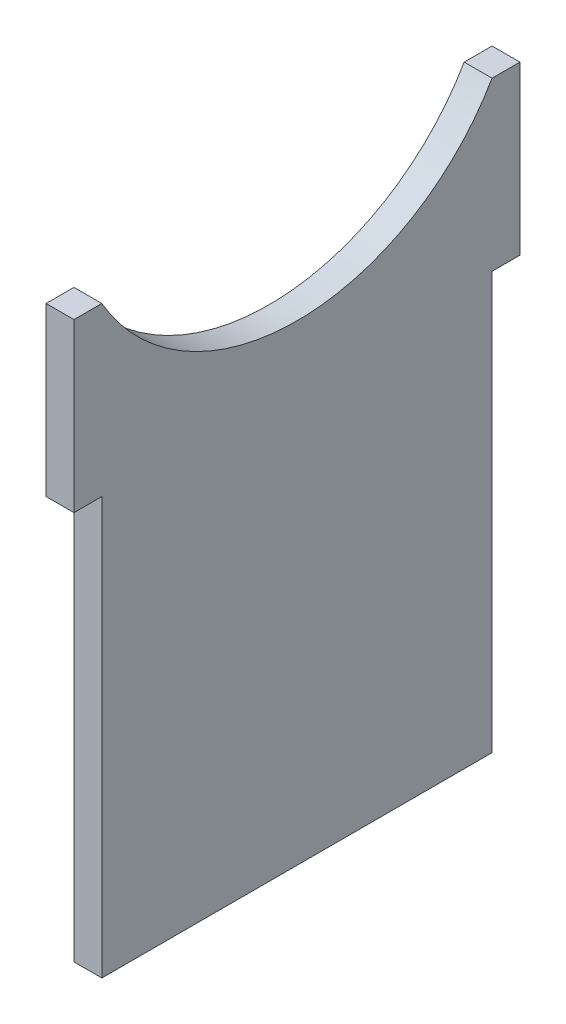
ISO-10303-21;
HEADER;
FILE_DESCRIPTION(('STEP AP214'),'2;1');
FILE_NAME('part.step','',(''),(''),'','','');
FILE_SCHEMA(('AUTOMOTIVE_DESIGN { 1 0 10303 214 1 1 1 1 }'));
ENDSEC;
DATA;
#1=APPLICATION_CONTEXT('core data for automotive mechanical design processes');
#2=APPLICATION_PROTOCOL_DEFINITION('international standard','automotive_design',2000,#1);
#3=PRODUCT_CONTEXT('',#1,'mechanical');
#4=PRODUCT('Part','Part','',(#3));
#5=PRODUCT_RELATED_PRODUCT_CATEGORY('part','',(#4));
#6=PRODUCT_DEFINITION_FORMATION('','',#4);
#7=PRODUCT_DEFINITION_CONTEXT('part definition',#1,'design');
#8=PRODUCT_DEFINITION('design','',#6,#7);
#9=PRODUCT_DEFINITION_SHAPE('','',#8);
#10=(LENGTH_UNIT() NAMED_UNIT(*) SI_UNIT(.MILLI.,.METRE.));
#11=(NAMED_UNIT(*) PLANE_ANGLE_UNIT() SI_UNIT($,.RADIAN.));
#12=(NAMED_UNIT(*) SI_UNIT($,.STERADIAN.) SOLID_ANGLE_UNIT());
#13=UNCERTAINTY_MEASURE_WITH_UNIT(LENGTH_MEASURE(1.E-05),#10,'distance_accuracy_value','');
#14=(GEOMETRIC_REPRESENTATION_CONTEXT(3) GLOBAL_UNCERTAINTY_ASSIGNED_CONTEXT((#13)) GLOBAL_UNIT_ASSIGNED_CONTEXT((#10,
#11,#12)) REPRESENTATION_CONTEXT('',''));
#15=CARTESIAN_POINT('',(0.,0.,0.));
#16=DIRECTION('',(0.,0.,1.));
#17=DIRECTION('',(1.,0.,0.));
#18=AXIS2_PLACEMENT_3D('',#15,#16,#17);
#19=CARTESIAN_POINT('',(1.5875,0.,0.));
#20=DIRECTION('',(-1.,0.,0.));
#21=DIRECTION('',(0.,0.,1.));
#22=AXIS2_PLACEMENT_3D('',#19,#20,#21);
#23=CYLINDRICAL_SURFACE('',#22,12.8316097327394);
#24=CARTESIAN_POINT('',(0.,0.,0.));
#25=DIRECTION('',(1.,0.,0.));
#26=DIRECTION('',(0.,0.,-1.));
#27=AXIS2_PLACEMENT_3D('',#24,#25,#26);
#28=CIRCLE('',#27,12.8316097327394);
#29=CARTESIAN_POINT('',(0.,-6.41580486636971,11.1125));
#30=VERTEX_POINT('',#29);
#31=CARTESIAN_POINT('',(0.,-6.41580486636971,-11.1125));
#32=VERTEX_POINT('',#31);
#33=EDGE_CURVE('E140',#30,#32,#28,.T.);
#34=ORIENTED_EDGE('',*,*,#33,.F.);
#35=DIRECTION('',(-1.,0.,0.));
#36=VECTOR('',#35,1.);
#37=CARTESIAN_POINT('',(1.5875,-6.41580486636971,11.1125));
#38=LINE('',#37,#36);
#39=CARTESIAN_POINT('',(1.5875,-6.41580486636971,11.1125));
#40=VERTEX_POINT('',#39);
#41=EDGE_CURVE('E11',#40,#30,#38,.T.);
#42=ORIENTED_EDGE('',*,*,#41,.F.);
#43=CARTESIAN_POINT('',(1.5875,0.,0.));
#44=DIRECTION('',(1.,0.,0.));
#45=DIRECTION('',(0.,0.,-1.));
#46=AXIS2_PLACEMENT_3D('',#43,#44,#45);
#47=CIRCLE('',#46,12.8316097327394);
#48=CARTESIAN_POINT('',(1.5875,-6.41580486636971,-11.1125));
#49=VERTEX_POINT('',#48);
#50=EDGE_CURVE('E162',#40,#49,#47,.T.);
#51=ORIENTED_EDGE('',*,*,#50,.T.);
#52=DIRECTION('',(-1.,0.,0.));
#53=VECTOR('',#52,1.);
#54=CARTESIAN_POINT('',(1.5875,-6.41580486636971,-11.1125));
#55=LINE('',#54,#53);
#56=EDGE_CURVE('E50',#49,#32,#55,.T.);
#57=ORIENTED_EDGE('',*,*,#56,.T.);
#58=EDGE_LOOP('',(#34,#42,#51,#57));
#59=FACE_BOUND('',#58,.T.);
#60=ADVANCED_FACE('F34',(#59),#23,.F.);
#61=CARTESIAN_POINT('',(1.5875,-6.41580486636971,0.));
#62=DIRECTION('',(0.,-1.,0.));
#63=DIRECTION('',(0.,0.,-1.));
#64=AXIS2_PLACEMENT_3D('',#61,#62,#63);
#65=PLANE('',#64);
#66=DIRECTION('',(0.,0.,1.));
#67=VECTOR('',#66,1.);
#68=CARTESIAN_POINT('',(0.,-6.41580486636971,0.));
#69=LINE('',#68,#67);
#70=CARTESIAN_POINT('',(0.,-6.41580486636971,12.7));
#71=VERTEX_POINT('',#70);
#72=EDGE_CURVE('E142',#30,#71,#69,.T.);
#73=ORIENTED_EDGE('',*,*,#72,.T.);
#74=DIRECTION('',(-1.,0.,0.));
#75=VECTOR('',#74,1.);
#76=CARTESIAN_POINT('',(1.5875,-6.41580486636971,12.7));
#77=LINE('',#76,#75);
#78=CARTESIAN_POINT('',(1.5875,-6.41580486636971,12.7));
#79=VERTEX_POINT('',#78);
#80=EDGE_CURVE('E42',#79,#71,#77,.T.);
#81=ORIENTED_EDGE('',*,*,#80,.F.);
#82=DIRECTION('',(0.,0.,1.));
#83=VECTOR('',#82,1.);
#84=CARTESIAN_POINT('',(1.5875,-6.41580486636971,0.));
#85=LINE('',#84,#83);
#86=EDGE_CURVE('E200',#40,#79,#85,.T.);
#87=ORIENTED_EDGE('',*,*,#86,.F.);
#88=ORIENTED_EDGE('',*,*,#41,.T.);
#89=EDGE_LOOP('',(#73,#81,#87,#88));
#90=FACE_BOUND('',#89,.T.);
#91=ADVANCED_FACE('F223',(#90),#65,.F.);
#92=CARTESIAN_POINT('',(1.5875,0.,12.7));
#93=DIRECTION('',(0.,0.,-1.));
#94=DIRECTION('',(0.,1.,0.));
#95=AXIS2_PLACEMENT_3D('',#92,#93,#94);
#96=PLANE('',#95);
#97=DIRECTION('',(0.,-1.,0.));
#98=VECTOR('',#97,1.);
#99=CARTESIAN_POINT('',(0.,0.,12.7));
#100=LINE('',#99,#98);
#101=CARTESIAN_POINT('',(0.,-15.9408048663697,12.7));
#102=VERTEX_POINT('',#101);
#103=EDGE_CURVE('E144',#71,#102,#100,.T.);
#104=ORIENTED_EDGE('',*,*,#103,.T.);
#105=DIRECTION('',(-1.,0.,0.));
#106=VECTOR('',#105,1.);
#107=CARTESIAN_POINT('',(1.5875,-15.9408048663697,12.7));
#108=LINE('',#107,#106);
#109=CARTESIAN_POINT('',(1.5875,-15.9408048663697,12.7));
#110=VERTEX_POINT('',#109);
#111=EDGE_CURVE('E174',#110,#102,#108,.T.);
#112=ORIENTED_EDGE('',*,*,#111,.F.);
#113=DIRECTION('',(0.,-1.,0.));
#114=VECTOR('',#113,1.);
#115=CARTESIAN_POINT('',(1.5875,0.,12.7));
#116=LINE('',#115,#114);
#117=EDGE_CURVE('E182',#79,#110,#116,.T.);
#118=ORIENTED_EDGE('',*,*,#117,.F.);
#119=ORIENTED_EDGE('',*,*,#80,.T.);
#120=EDGE_LOOP('',(#104,#112,#118,#119));
#121=FACE_BOUND('',#120,.T.);
#122=ADVANCED_FACE('F180',(#121),#96,.F.);
#123=CARTESIAN_POINT('',(1.5875,-15.9408048663697,0.));
#124=DIRECTION('',(0.,-1.,0.));
#125=DIRECTION('',(0.,0.,-1.));
#126=AXIS2_PLACEMENT_3D('',#123,#124,#125);
#127=PLANE('',#126);
#128=DIRECTION('',(0.,0.,1.));
#129=VECTOR('',#128,1.);
#130=CARTESIAN_POINT('',(0.,-15.9408048663697,0.));
#131=LINE('',#130,#129);
#132=CARTESIAN_POINT('',(0.,-15.9408048663697,11.1125));
#133=VERTEX_POINT('',#132);
#134=EDGE_CURVE('E147',#133,#102,#131,.T.);
#135=ORIENTED_EDGE('',*,*,#134,.F.);
#136=DIRECTION('',(-1.,0.,0.));
#137=VECTOR('',#136,1.);
#138=CARTESIAN_POINT('',(1.5875,-15.9408048663697,11.1125));
#139=LINE('',#138,#137);
#140=CARTESIAN_POINT('',(1.5875,-15.9408048663697,11.1125));
#141=VERTEX_POINT('',#140);
#142=EDGE_CURVE('E172',#141,#133,#139,.T.);
#143=ORIENTED_EDGE('',*,*,#142,.F.);
#144=DIRECTION('',(0.,0.,1.));
#145=VECTOR('',#144,1.);
#146=CARTESIAN_POINT('',(1.5875,-15.9408048663697,0.));
#147=LINE('',#146,#145);
#148=EDGE_CURVE('E195',#141,#110,#147,.T.);
#149=ORIENTED_EDGE('',*,*,#148,.T.);
#150=ORIENTED_EDGE('',*,*,#111,.T.);
#151=EDGE_LOOP('',(#135,#143,#149,#150));
#152=FACE_BOUND('',#151,.T.);
#153=ADVANCED_FACE('F191',(#152),#127,.T.);
#154=CARTESIAN_POINT('',(1.5875,0.,11.1125));
#155=DIRECTION('',(0.,0.,-1.));
#156=DIRECTION('',(0.,1.,0.));
#157=AXIS2_PLACEMENT_3D('',#154,#155,#156);
#158=PLANE('',#157);
#159=DIRECTION('',(0.,-1.,0.));
#160=VECTOR('',#159,1.);
#161=CARTESIAN_POINT('',(0.,0.,11.1125));
#162=LINE('',#161,#160);
#163=CARTESIAN_POINT('',(0.,-39.6875,11.1125));
#164=VERTEX_POINT('',#163);
#165=EDGE_CURVE('E150',#133,#164,#162,.T.);
#166=ORIENTED_EDGE('',*,*,#165,.T.);
#167=DIRECTION('',(-1.,0.,0.));
#168=VECTOR('',#167,1.);
#169=CARTESIAN_POINT('',(1.5875,-39.6875,11.1125));
#170=LINE('',#169,#168);
#171=CARTESIAN_POINT('',(1.5875,-39.6875,11.1125));
#172=VERTEX_POINT('',#171);
#173=EDGE_CURVE('E169',#172,#164,#170,.T.);
#174=ORIENTED_EDGE('',*,*,#173,.F.);
#175=DIRECTION('',(0.,-1.,0.));
#176=VECTOR('',#175,1.);
#177=CARTESIAN_POINT('',(1.5875,0.,11.1125));
#178=LINE('',#177,#176);
#179=EDGE_CURVE('E196',#141,#172,#178,.T.);
#180=ORIENTED_EDGE('',*,*,#179,.F.);
#181=ORIENTED_EDGE('',*,*,#142,.T.);
#182=EDGE_LOOP('',(#166,#174,#180,#181));
#183=FACE_BOUND('',#182,.T.);
#184=ADVANCED_FACE('F234',(#183),#158,.F.);
#185=CARTESIAN_POINT('',(1.5875,-39.6875,0.));
#186=DIRECTION('',(0.,1.,0.));
#187=DIRECTION('',(0.,0.,1.));
#188=AXIS2_PLACEMENT_3D('',#185,#186,#187);
#189=PLANE('',#188);
#190=DIRECTION('',(0.,0.,-1.));
#191=VECTOR('',#190,1.);
#192=CARTESIAN_POINT('',(0.,-39.6875,0.));
#193=LINE('',#192,#191);
#194=CARTESIAN_POINT('',(0.,-39.6875,-11.1125));
#195=VERTEX_POINT('',#194);
#196=EDGE_CURVE('E152',#164,#195,#193,.T.);
#197=ORIENTED_EDGE('',*,*,#196,.T.);
#198=DIRECTION('',(-1.,0.,0.));
#199=VECTOR('',#198,1.);
#200=CARTESIAN_POINT('',(1.5875,-39.6875,-11.1125));
#201=LINE('',#200,#199);
#202=CARTESIAN_POINT('',(1.5875,-39.6875,-11.1125));
#203=VERTEX_POINT('',#202);
#204=EDGE_CURVE('E166',#203,#195,#201,.T.);
#205=ORIENTED_EDGE('',*,*,#204,.F.);
#206=DIRECTION('',(0.,0.,-1.));
#207=VECTOR('',#206,1.);
#208=CARTESIAN_POINT('',(1.5875,-39.6875,0.));
#209=LINE('',#208,#207);
#210=EDGE_CURVE('E198',#172,#203,#209,.T.);
#211=ORIENTED_EDGE('',*,*,#210,.F.);
#212=ORIENTED_EDGE('',*,*,#173,.T.);
#213=EDGE_LOOP('',(#197,#205,#211,#212));
#214=FACE_BOUND('',#213,.T.);
#215=ADVANCED_FACE('F208',(#214),#189,.F.);
#216=CARTESIAN_POINT('',(1.5875,0.,-11.1125));
#217=DIRECTION('',(0.,0.,1.));
#218=DIRECTION('',(0.,-1.,0.));
#219=AXIS2_PLACEMENT_3D('',#216,#217,#218);
#220=PLANE('',#219);
#221=DIRECTION('',(0.,1.,0.));
#222=VECTOR('',#221,1.);
#223=CARTESIAN_POINT('',(0.,0.,-11.1125));
#224=LINE('',#223,#222);
#225=CARTESIAN_POINT('',(0.,-15.9408048663697,-11.1125));
#226=VERTEX_POINT('',#225);
#227=EDGE_CURVE('E154',#195,#226,#224,.T.);
#228=ORIENTED_EDGE('',*,*,#227,.T.);
#229=DIRECTION('',(-1.,0.,0.));
#230=VECTOR('',#229,1.);
#231=CARTESIAN_POINT('',(1.5875,-15.9408048663697,-11.1125));
#232=LINE('',#231,#230);
#233=CARTESIAN_POINT('',(1.5875,-15.9408048663697,-11.1125));
#234=VERTEX_POINT('',#233);
#235=EDGE_CURVE('E132',#234,#226,#232,.T.);
#236=ORIENTED_EDGE('',*,*,#235,.F.);
#237=DIRECTION('',(0.,1.,0.));
#238=VECTOR('',#237,1.);
#239=CARTESIAN_POINT('',(1.5875,0.,-11.1125));
#240=LINE('',#239,#238);
#241=EDGE_CURVE('E120',#203,#234,#240,.T.);
#242=ORIENTED_EDGE('',*,*,#241,.F.);
#243=ORIENTED_EDGE('',*,*,#204,.T.);
#244=EDGE_LOOP('',(#228,#236,#242,#243));
#245=FACE_BOUND('',#244,.T.);
#246=ADVANCED_FACE('F211',(#245),#220,.F.);
#247=CARTESIAN_POINT('',(1.5875,-15.9408048663697,0.));
#248=DIRECTION('',(0.,1.,0.));
#249=DIRECTION('',(0.,0.,1.));
#250=AXIS2_PLACEMENT_3D('',#247,#248,#249);
#251=PLANE('',#250);
#252=DIRECTION('',(0.,0.,-1.));
#253=VECTOR('',#252,1.);
#254=CARTESIAN_POINT('',(0.,-15.9408048663697,0.));
#255=LINE('',#254,#253);
#256=CARTESIAN_POINT('',(0.,-15.9408048663697,-12.7));
#257=VERTEX_POINT('',#256);
#258=EDGE_CURVE('E129',#226,#257,#255,.T.);
#259=ORIENTED_EDGE('',*,*,#258,.T.);
#260=DIRECTION('',(-1.,0.,0.));
#261=VECTOR('',#260,1.);
#262=CARTESIAN_POINT('',(1.5875,-15.9408048663697,-12.7));
#263=LINE('',#262,#261);
#264=CARTESIAN_POINT('',(1.5875,-15.9408048663697,-12.7));
#265=VERTEX_POINT('',#264);
#266=EDGE_CURVE('E126',#265,#257,#263,.T.);
#267=ORIENTED_EDGE('',*,*,#266,.F.);
#268=DIRECTION('',(0.,0.,-1.));
#269=VECTOR('',#268,1.);
#270=CARTESIAN_POINT('',(1.5875,-15.9408048663697,0.));
#271=LINE('',#270,#269);
#272=EDGE_CURVE('E112',#234,#265,#271,.T.);
#273=ORIENTED_EDGE('',*,*,#272,.F.);
#274=ORIENTED_EDGE('',*,*,#235,.T.);
#275=EDGE_LOOP('',(#259,#267,#273,#274));
#276=FACE_BOUND('',#275,.T.);
#277=ADVANCED_FACE('F127',(#276),#251,.F.);
#278=CARTESIAN_POINT('',(1.5875,0.,-12.7));
#279=DIRECTION('',(0.,0.,-1.));
#280=DIRECTION('',(0.,1.,0.));
#281=AXIS2_PLACEMENT_3D('',#278,#279,#280);
#282=PLANE('',#281);
#283=DIRECTION('',(0.,-1.,0.));
#284=VECTOR('',#283,1.);
#285=CARTESIAN_POINT('',(0.,0.,-12.7));
#286=LINE('',#285,#284);
#287=CARTESIAN_POINT('',(0.,-6.41580486636971,-12.7));
#288=VERTEX_POINT('',#287);
#289=EDGE_CURVE('E157',#288,#257,#286,.T.);
#290=ORIENTED_EDGE('',*,*,#289,.F.);
#291=DIRECTION('',(-1.,0.,0.));
#292=VECTOR('',#291,1.);
#293=CARTESIAN_POINT('',(1.5875,-6.41580486636971,-12.7));
#294=LINE('',#293,#292);
#295=CARTESIAN_POINT('',(1.5875,-6.41580486636971,-12.7));
#296=VERTEX_POINT('',#295);
#297=EDGE_CURVE('E81',#296,#288,#294,.T.);
#298=ORIENTED_EDGE('',*,*,#297,.F.);
#299=DIRECTION('',(0.,-1.,0.));
#300=VECTOR('',#299,1.);
#301=CARTESIAN_POINT('',(1.5875,0.,-12.7));
#302=LINE('',#301,#300);
#303=EDGE_CURVE('E118',#296,#265,#302,.T.);
#304=ORIENTED_EDGE('',*,*,#303,.T.);
#305=ORIENTED_EDGE('',*,*,#266,.T.);
#306=EDGE_LOOP('',(#290,#298,#304,#305));
#307=FACE_BOUND('',#306,.T.);
#308=ADVANCED_FACE('F134',(#307),#282,.T.);
#309=CARTESIAN_POINT('',(1.5875,-6.41580486636971,0.));
#310=DIRECTION('',(0.,1.,0.));
#311=DIRECTION('',(0.,0.,1.));
#312=AXIS2_PLACEMENT_3D('',#309,#310,#311);
#313=PLANE('',#312);
#314=DIRECTION('',(0.,0.,-1.));
#315=VECTOR('',#314,1.);
#316=CARTESIAN_POINT('',(0.,-6.41580486636971,0.));
#317=LINE('',#316,#315);
#318=EDGE_CURVE('E159',#32,#288,#317,.T.);
#319=ORIENTED_EDGE('',*,*,#318,.F.);
#320=ORIENTED_EDGE('',*,*,#56,.F.);
#321=DIRECTION('',(0.,0.,-1.));
#322=VECTOR('',#321,1.);
#323=CARTESIAN_POINT('',(1.5875,-6.41580486636971,0.));
#324=LINE('',#323,#322);
#325=EDGE_CURVE('E135',#49,#296,#324,.T.);
#326=ORIENTED_EDGE('',*,*,#325,.T.);
#327=ORIENTED_EDGE('',*,*,#297,.T.);
#328=EDGE_LOOP('',(#319,#320,#326,#327));
#329=FACE_BOUND('',#328,.T.);
#330=ADVANCED_FACE('F212',(#329),#313,.T.);
#331=CARTESIAN_POINT('',(1.5875,0.,0.));
#332=DIRECTION('',(1.,0.,0.));
#333=DIRECTION('',(0.,0.,-1.));
#334=AXIS2_PLACEMENT_3D('',#331,#332,#333);
#335=PLANE('',#334);
#336=ORIENTED_EDGE('',*,*,#50,.F.);
#337=ORIENTED_EDGE('',*,*,#86,.T.);
#338=ORIENTED_EDGE('',*,*,#117,.T.);
#339=ORIENTED_EDGE('',*,*,#148,.F.);
#340=ORIENTED_EDGE('',*,*,#179,.T.);
#341=ORIENTED_EDGE('',*,*,#210,.T.);
#342=ORIENTED_EDGE('',*,*,#241,.T.);
#343=ORIENTED_EDGE('',*,*,#272,.T.);
#344=ORIENTED_EDGE('',*,*,#303,.F.);
#345=ORIENTED_EDGE('',*,*,#325,.F.);
#346=EDGE_LOOP('',(#336,#337,#338,#339,#340,#341,#342,#343,#344,#345));
#347=FACE_BOUND('',#346,.T.);
#348=ADVANCED_FACE('F115',(#347),#335,.T.);
#349=CARTESIAN_POINT('',(0.,0.,0.));
#350=DIRECTION('',(1.,0.,0.));
#351=DIRECTION('',(0.,0.,-1.));
#352=AXIS2_PLACEMENT_3D('',#349,#350,#351);
#353=PLANE('',#352);
#354=ORIENTED_EDGE('',*,*,#33,.T.);
#355=ORIENTED_EDGE('',*,*,#318,.T.);
#356=ORIENTED_EDGE('',*,*,#289,.T.);
#357=ORIENTED_EDGE('',*,*,#258,.F.);
#358=ORIENTED_EDGE('',*,*,#227,.F.);
#359=ORIENTED_EDGE('',*,*,#196,.F.);
#360=ORIENTED_EDGE('',*,*,#165,.F.);
#361=ORIENTED_EDGE('',*,*,#134,.T.);
#362=ORIENTED_EDGE('',*,*,#103,.F.);
#363=ORIENTED_EDGE('',*,*,#72,.F.);
#364=EDGE_LOOP('',(#354,#355,#356,#357,#358,#359,#360,#361,#362,#363));
#365=FACE_BOUND('',#364,.T.);
#366=ADVANCED_FACE('F186',(#365),#353,.F.);
#367=CLOSED_SHELL('',(#60,#91,#122,#153,#184,#215,#246,#277,#308,#330,#348,#366));
#368=MANIFOLD_SOLID_BREP('B2',#367);
#369=ADVANCED_BREP_SHAPE_REPRESENTATION('',(#18,#368),#14);
#370=SHAPE_DEFINITION_REPRESENTATION(#9,#369);
ENDSEC;
END-ISO-10303-21;
